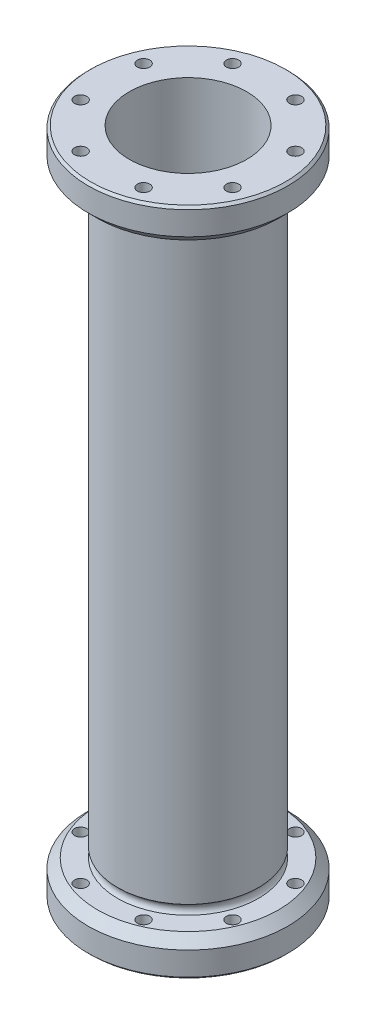
ISO-10303-21;
HEADER;
FILE_DESCRIPTION(('STEP AP214'),'2;1');
FILE_NAME('part.step','',(''),(''),'','','');
FILE_SCHEMA(('AUTOMOTIVE_DESIGN { 1 0 10303 214 1 1 1 1 }'));
ENDSEC;
DATA;
#1=APPLICATION_CONTEXT('core data for automotive mechanical design processes');
#2=APPLICATION_PROTOCOL_DEFINITION('international standard','automotive_design',2000,#1);
#3=PRODUCT_CONTEXT('',#1,'mechanical');
#4=PRODUCT('Part','Part','',(#3));
#5=PRODUCT_RELATED_PRODUCT_CATEGORY('part','',(#4));
#6=PRODUCT_DEFINITION_FORMATION('','',#4);
#7=PRODUCT_DEFINITION_CONTEXT('part definition',#1,'design');
#8=PRODUCT_DEFINITION('design','',#6,#7);
#9=PRODUCT_DEFINITION_SHAPE('','',#8);
#10=(LENGTH_UNIT() NAMED_UNIT(*) SI_UNIT(.MILLI.,.METRE.));
#11=(NAMED_UNIT(*) PLANE_ANGLE_UNIT() SI_UNIT($,.RADIAN.));
#12=(NAMED_UNIT(*) SI_UNIT($,.STERADIAN.) SOLID_ANGLE_UNIT());
#13=UNCERTAINTY_MEASURE_WITH_UNIT(LENGTH_MEASURE(1.E-05),#10,'distance_accuracy_value','');
#14=(GEOMETRIC_REPRESENTATION_CONTEXT(3) GLOBAL_UNCERTAINTY_ASSIGNED_CONTEXT((#13)) GLOBAL_UNIT_ASSIGNED_CONTEXT((#10,
#11,#12)) REPRESENTATION_CONTEXT('',''));
#15=CARTESIAN_POINT('',(0.,0.,0.));
#16=DIRECTION('',(0.,0.,1.));
#17=DIRECTION('',(1.,0.,0.));
#18=AXIS2_PLACEMENT_3D('',#15,#16,#17);
#19=CARTESIAN_POINT('',(85.,570.,0.));
#20=DIRECTION('',(0.,1.,0.));
#21=DIRECTION('',(0.,0.,1.));
#22=AXIS2_PLACEMENT_3D('',#19,#20,#21);
#23=PLANE('',#22);
#24=CARTESIAN_POINT('',(0.,570.,0.));
#25=DIRECTION('',(0.,1.,0.));
#26=DIRECTION('',(0.,0.,1.));
#27=AXIS2_PLACEMENT_3D('',#24,#25,#26);
#28=CIRCLE('',#27,82.9999999999999);
#29=CARTESIAN_POINT('',(0.,570.,82.9999999999999));
#30=VERTEX_POINT('',#29);
#31=EDGE_CURVE('E43',#30,#30,#28,.T.);
#32=ORIENTED_EDGE('',*,*,#31,.T.);
#33=EDGE_LOOP('',(#32));
#34=FACE_BOUND('',#33,.T.);
#35=CARTESIAN_POINT('',(-26.787840265557,570.,64.6715672757898));
#36=DIRECTION('',(0.,-1.,0.));
#37=DIRECTION('',(0.,0.,-1.));
#38=AXIS2_PLACEMENT_3D('',#35,#36,#37);
#39=CIRCLE('',#38,5.24999999999986);
#40=CARTESIAN_POINT('',(-26.787840265557,570.,59.4215672757899));
#41=VERTEX_POINT('',#40);
#42=EDGE_CURVE('E69',#41,#41,#39,.T.);
#43=ORIENTED_EDGE('',*,*,#42,.T.);
#44=EDGE_LOOP('',(#43));
#45=FACE_BOUND('',#44,.T.);
#46=CARTESIAN_POINT('',(26.7878402655566,570.,-64.67156727579));
#47=DIRECTION('',(0.,-1.,0.));
#48=DIRECTION('',(0.,0.,-1.));
#49=AXIS2_PLACEMENT_3D('',#46,#47,#48);
#50=CIRCLE('',#49,5.24999999999986);
#51=CARTESIAN_POINT('',(26.7878402655566,570.,-69.9215672757898));
#52=VERTEX_POINT('',#51);
#53=EDGE_CURVE('E144',#52,#52,#50,.T.);
#54=ORIENTED_EDGE('',*,*,#53,.T.);
#55=EDGE_LOOP('',(#54));
#56=FACE_BOUND('',#55,.T.);
#57=CARTESIAN_POINT('',(-26.7878402655561,570.,-64.6715672757902));
#58=DIRECTION('',(0.,-1.,0.));
#59=DIRECTION('',(0.,0.,-1.));
#60=AXIS2_PLACEMENT_3D('',#57,#58,#59);
#61=CIRCLE('',#60,5.24999999999986);
#62=CARTESIAN_POINT('',(-26.7878402655561,570.,-69.92156727579));
#63=VERTEX_POINT('',#62);
#64=EDGE_CURVE('E132',#63,#63,#61,.T.);
#65=ORIENTED_EDGE('',*,*,#64,.T.);
#66=EDGE_LOOP('',(#65));
#67=FACE_BOUND('',#66,.T.);
#68=CARTESIAN_POINT('',(-64.6715672757901,570.,-26.7878402655564));
#69=DIRECTION('',(0.,-1.,0.));
#70=DIRECTION('',(0.,0.,-1.));
#71=AXIS2_PLACEMENT_3D('',#68,#69,#70);
#72=CIRCLE('',#71,5.24999999999986);
#73=CARTESIAN_POINT('',(-64.6715672757901,570.,-32.0378402655562));
#74=VERTEX_POINT('',#73);
#75=EDGE_CURVE('E120',#74,#74,#72,.T.);
#76=ORIENTED_EDGE('',*,*,#75,.T.);
#77=EDGE_LOOP('',(#76));
#78=FACE_BOUND('',#77,.T.);
#79=CARTESIAN_POINT('',(-64.6715672757901,570.,26.7878402655563));
#80=DIRECTION('',(0.,-1.,0.));
#81=DIRECTION('',(0.,0.,-1.));
#82=AXIS2_PLACEMENT_3D('',#79,#80,#81);
#83=CIRCLE('',#82,5.24999999999986);
#84=CARTESIAN_POINT('',(-64.6715672757901,570.,21.5378402655565));
#85=VERTEX_POINT('',#84);
#86=EDGE_CURVE('E108',#85,#85,#83,.T.);
#87=ORIENTED_EDGE('',*,*,#86,.T.);
#88=EDGE_LOOP('',(#87));
#89=FACE_BOUND('',#88,.T.);
#90=CARTESIAN_POINT('',(0.,570.,0.));
#91=DIRECTION('',(0.,-1.,0.));
#92=DIRECTION('',(0.,0.,-1.));
#93=AXIS2_PLACEMENT_3D('',#90,#91,#92);
#94=CIRCLE('',#93,50.);
#95=CARTESIAN_POINT('',(0.,570.,-50.));
#96=VERTEX_POINT('',#95);
#97=EDGE_CURVE('E87',#96,#96,#94,.T.);
#98=ORIENTED_EDGE('',*,*,#97,.T.);
#99=EDGE_LOOP('',(#98));
#100=FACE_BOUND('',#99,.T.);
#101=CARTESIAN_POINT('',(64.6715672757901,570.,-26.7878402655563));
#102=DIRECTION('',(0.,-1.,0.));
#103=DIRECTION('',(0.,0.,-1.));
#104=AXIS2_PLACEMENT_3D('',#101,#102,#103);
#105=CIRCLE('',#104,5.24999999999987);
#106=CARTESIAN_POINT('',(64.6715672757901,570.,-32.0378402655562));
#107=VERTEX_POINT('',#106);
#108=EDGE_CURVE('E84',#107,#107,#105,.T.);
#109=ORIENTED_EDGE('',*,*,#108,.T.);
#110=EDGE_LOOP('',(#109));
#111=FACE_BOUND('',#110,.T.);
#112=CARTESIAN_POINT('',(64.6715672757899,570.,26.7878402655568));
#113=DIRECTION('',(0.,-1.,0.));
#114=DIRECTION('',(0.,0.,-1.));
#115=AXIS2_PLACEMENT_3D('',#112,#113,#114);
#116=CIRCLE('',#115,5.24999999999987);
#117=CARTESIAN_POINT('',(64.6715672757899,570.,21.5378402655569));
#118=VERTEX_POINT('',#117);
#119=EDGE_CURVE('E79',#118,#118,#116,.T.);
#120=ORIENTED_EDGE('',*,*,#119,.T.);
#121=EDGE_LOOP('',(#120));
#122=FACE_BOUND('',#121,.T.);
#123=CARTESIAN_POINT('',(26.7878402655557,570.,64.6715672757903));
#124=DIRECTION('',(0.,-1.,0.));
#125=DIRECTION('',(0.,0.,-1.));
#126=AXIS2_PLACEMENT_3D('',#123,#124,#125);
#127=CIRCLE('',#126,5.24999999999986);
#128=CARTESIAN_POINT('',(26.7878402655557,570.,59.4215672757905));
#129=VERTEX_POINT('',#128);
#130=EDGE_CURVE('E74',#129,#129,#127,.T.);
#131=ORIENTED_EDGE('',*,*,#130,.T.);
#132=EDGE_LOOP('',(#131));
#133=FACE_BOUND('',#132,.T.);
#134=ADVANCED_FACE('F32',(#34,#45,#56,#67,#78,#89,#100,#111,#122,#133),#23,.T.);
#135=CARTESIAN_POINT('',(0.,-1001.13524312968,0.));
#136=DIRECTION('',(0.,-1.,0.));
#137=DIRECTION('',(0.,0.,-1.));
#138=AXIS2_PLACEMENT_3D('',#135,#136,#137);
#139=CYLINDRICAL_SURFACE('',#138,60.);
#140=CARTESIAN_POINT('',(0.,532.,0.));
#141=DIRECTION('',(0.,1.,0.));
#142=DIRECTION('',(0.,0.,1.));
#143=AXIS2_PLACEMENT_3D('',#140,#141,#142);
#144=CIRCLE('',#143,60.);
#145=CARTESIAN_POINT('',(0.,532.,60.));
#146=VERTEX_POINT('',#145);
#147=EDGE_CURVE('E90',#146,#146,#144,.T.);
#148=ORIENTED_EDGE('',*,*,#147,.F.);
#149=EDGE_LOOP('',(#148));
#150=FACE_BOUND('',#149,.T.);
#151=CARTESIAN_POINT('',(0.,38.,0.));
#152=DIRECTION('',(0.,1.,0.));
#153=DIRECTION('',(0.,0.,1.));
#154=AXIS2_PLACEMENT_3D('',#151,#152,#153);
#155=CIRCLE('',#154,60.);
#156=CARTESIAN_POINT('',(0.,38.,60.));
#157=VERTEX_POINT('',#156);
#158=EDGE_CURVE('E99',#157,#157,#155,.T.);
#159=ORIENTED_EDGE('',*,*,#158,.T.);
#160=EDGE_LOOP('',(#159));
#161=FACE_BOUND('',#160,.T.);
#162=ADVANCED_FACE('F205',(#150,#161),#139,.T.);
#163=CARTESIAN_POINT('',(0.,-1001.13524312968,0.));
#164=DIRECTION('',(0.,-1.,0.));
#165=DIRECTION('',(0.,0.,-1.));
#166=AXIS2_PLACEMENT_3D('',#163,#164,#165);
#167=CYLINDRICAL_SURFACE('',#166,50.);
#168=CARTESIAN_POINT('',(0.,0.,0.));
#169=DIRECTION('',(0.,-1.,0.));
#170=DIRECTION('',(0.,0.,-1.));
#171=AXIS2_PLACEMENT_3D('',#168,#169,#170);
#172=CIRCLE('',#171,50.0000000000001);
#173=CARTESIAN_POINT('',(0.,0.,-50.0000000000001));
#174=VERTEX_POINT('',#173);
#175=EDGE_CURVE('E64',#174,#174,#172,.T.);
#176=ORIENTED_EDGE('',*,*,#175,.T.);
#177=EDGE_LOOP('',(#176));
#178=FACE_BOUND('',#177,.T.);
#179=ORIENTED_EDGE('',*,*,#97,.F.);
#180=EDGE_LOOP('',(#179));
#181=FACE_BOUND('',#180,.T.);
#182=ADVANCED_FACE('F185',(#178,#181),#167,.F.);
#183=CARTESIAN_POINT('',(50.0000000000001,0.,0.));
#184=DIRECTION('',(0.,-1.,0.));
#185=DIRECTION('',(0.,0.,-1.));
#186=AXIS2_PLACEMENT_3D('',#183,#184,#185);
#187=PLANE('',#186);
#188=CARTESIAN_POINT('',(0.,0.,0.));
#189=DIRECTION('',(0.,-1.,0.));
#190=DIRECTION('',(0.,0.,-1.));
#191=AXIS2_PLACEMENT_3D('',#188,#189,#190);
#192=CIRCLE('',#191,83.);
#193=CARTESIAN_POINT('',(0.,0.,-83.));
#194=VERTEX_POINT('',#193);
#195=EDGE_CURVE('E39',#194,#194,#192,.T.);
#196=ORIENTED_EDGE('',*,*,#195,.T.);
#197=EDGE_LOOP('',(#196));
#198=FACE_BOUND('',#197,.T.);
#199=CARTESIAN_POINT('',(-26.787840265557,0.,64.6715672757898));
#200=DIRECTION('',(0.,-1.,0.));
#201=DIRECTION('',(0.,0.,-1.));
#202=AXIS2_PLACEMENT_3D('',#199,#200,#201);
#203=CIRCLE('',#202,5.24999999999999);
#204=CARTESIAN_POINT('',(-26.787840265557,0.,59.4215672757898));
#205=VERTEX_POINT('',#204);
#206=EDGE_CURVE('E175',#205,#205,#203,.T.);
#207=ORIENTED_EDGE('',*,*,#206,.F.);
#208=EDGE_LOOP('',(#207));
#209=FACE_BOUND('',#208,.T.);
#210=CARTESIAN_POINT('',(26.7878402655557,0.,64.6715672757903));
#211=DIRECTION('',(0.,-1.,0.));
#212=DIRECTION('',(0.,0.,-1.));
#213=AXIS2_PLACEMENT_3D('',#210,#211,#212);
#214=CIRCLE('',#213,5.24999999999999);
#215=CARTESIAN_POINT('',(26.7878402655557,0.,59.4215672757903));
#216=VERTEX_POINT('',#215);
#217=EDGE_CURVE('E168',#216,#216,#214,.T.);
#218=ORIENTED_EDGE('',*,*,#217,.F.);
#219=EDGE_LOOP('',(#218));
#220=FACE_BOUND('',#219,.T.);
#221=CARTESIAN_POINT('',(64.6715672757899,0.,26.7878402655568));
#222=DIRECTION('',(0.,-1.,0.));
#223=DIRECTION('',(0.,0.,-1.));
#224=AXIS2_PLACEMENT_3D('',#221,#222,#223);
#225=CIRCLE('',#224,5.24999999999999);
#226=CARTESIAN_POINT('',(64.6715672757899,0.,21.5378402655568));
#227=VERTEX_POINT('',#226);
#228=EDGE_CURVE('E161',#227,#227,#225,.T.);
#229=ORIENTED_EDGE('',*,*,#228,.F.);
#230=EDGE_LOOP('',(#229));
#231=FACE_BOUND('',#230,.T.);
#232=CARTESIAN_POINT('',(64.6715672757901,0.,-26.7878402655563));
#233=DIRECTION('',(0.,-1.,0.));
#234=DIRECTION('',(0.,0.,-1.));
#235=AXIS2_PLACEMENT_3D('',#232,#233,#234);
#236=CIRCLE('',#235,5.24999999999999);
#237=CARTESIAN_POINT('',(64.6715672757901,0.,-32.0378402655563));
#238=VERTEX_POINT('',#237);
#239=EDGE_CURVE('E154',#238,#238,#236,.T.);
#240=ORIENTED_EDGE('',*,*,#239,.F.);
#241=EDGE_LOOP('',(#240));
#242=FACE_BOUND('',#241,.T.);
#243=CARTESIAN_POINT('',(26.7878402655566,0.,-64.67156727579));
#244=DIRECTION('',(0.,-1.,0.));
#245=DIRECTION('',(0.,0.,-1.));
#246=AXIS2_PLACEMENT_3D('',#243,#244,#245);
#247=CIRCLE('',#246,5.24999999999999);
#248=CARTESIAN_POINT('',(26.7878402655566,0.,-69.92156727579));
#249=VERTEX_POINT('',#248);
#250=EDGE_CURVE('E147',#249,#249,#247,.T.);
#251=ORIENTED_EDGE('',*,*,#250,.F.);
#252=EDGE_LOOP('',(#251));
#253=FACE_BOUND('',#252,.T.);
#254=CARTESIAN_POINT('',(-26.7878402655561,0.,-64.6715672757902));
#255=DIRECTION('',(0.,-1.,0.));
#256=DIRECTION('',(0.,0.,-1.));
#257=AXIS2_PLACEMENT_3D('',#254,#255,#256);
#258=CIRCLE('',#257,5.24999999999999);
#259=CARTESIAN_POINT('',(-26.7878402655561,0.,-69.9215672757901));
#260=VERTEX_POINT('',#259);
#261=EDGE_CURVE('E135',#260,#260,#258,.T.);
#262=ORIENTED_EDGE('',*,*,#261,.F.);
#263=EDGE_LOOP('',(#262));
#264=FACE_BOUND('',#263,.T.);
#265=CARTESIAN_POINT('',(-64.6715672757901,0.,-26.7878402655564));
#266=DIRECTION('',(0.,-1.,0.));
#267=DIRECTION('',(0.,0.,-1.));
#268=AXIS2_PLACEMENT_3D('',#265,#266,#267);
#269=CIRCLE('',#268,5.24999999999999);
#270=CARTESIAN_POINT('',(-64.6715672757901,0.,-32.0378402655563));
#271=VERTEX_POINT('',#270);
#272=EDGE_CURVE('E123',#271,#271,#269,.T.);
#273=ORIENTED_EDGE('',*,*,#272,.F.);
#274=EDGE_LOOP('',(#273));
#275=FACE_BOUND('',#274,.T.);
#276=CARTESIAN_POINT('',(-64.6715672757901,0.,26.7878402655563));
#277=DIRECTION('',(0.,-1.,0.));
#278=DIRECTION('',(0.,0.,-1.));
#279=AXIS2_PLACEMENT_3D('',#276,#277,#278);
#280=CIRCLE('',#279,5.24999999999999);
#281=CARTESIAN_POINT('',(-64.6715672757901,0.,21.5378402655563));
#282=VERTEX_POINT('',#281);
#283=EDGE_CURVE('E111',#282,#282,#280,.T.);
#284=ORIENTED_EDGE('',*,*,#283,.F.);
#285=EDGE_LOOP('',(#284));
#286=FACE_BOUND('',#285,.T.);
#287=ORIENTED_EDGE('',*,*,#175,.F.);
#288=EDGE_LOOP('',(#287));
#289=FACE_BOUND('',#288,.T.);
#290=ADVANCED_FACE('F181',(#198,#209,#220,#231,#242,#253,#264,#275,#286,#289),#187,.T.);
#291=CARTESIAN_POINT('',(0.,-1001.13524312968,0.));
#292=DIRECTION('',(0.,-1.,0.));
#293=DIRECTION('',(0.,0.,-1.));
#294=AXIS2_PLACEMENT_3D('',#291,#292,#293);
#295=CYLINDRICAL_SURFACE('',#294,85.);
#296=CARTESIAN_POINT('',(0.,2.00000000000022,0.));
#297=DIRECTION('',(0.,-1.,0.));
#298=DIRECTION('',(0.,0.,-1.));
#299=AXIS2_PLACEMENT_3D('',#296,#297,#298);
#300=CIRCLE('',#299,85.);
#301=CARTESIAN_POINT('',(0.,2.00000000000022,-85.));
#302=VERTEX_POINT('',#301);
#303=EDGE_CURVE('E10',#302,#302,#300,.F.);
#304=ORIENTED_EDGE('',*,*,#303,.T.);
#305=EDGE_LOOP('',(#304));
#306=FACE_BOUND('',#305,.T.);
#307=CARTESIAN_POINT('',(0.,21.9999999999998,0.));
#308=DIRECTION('',(0.,1.,0.));
#309=DIRECTION('',(0.,0.,1.));
#310=AXIS2_PLACEMENT_3D('',#307,#308,#309);
#311=CIRCLE('',#310,85.);
#312=CARTESIAN_POINT('',(0.,21.9999999999998,85.));
#313=VERTEX_POINT('',#312);
#314=EDGE_CURVE('E55',#313,#313,#311,.F.);
#315=ORIENTED_EDGE('',*,*,#314,.T.);
#316=EDGE_LOOP('',(#315));
#317=FACE_BOUND('',#316,.T.);
#318=ADVANCED_FACE('F184',(#306,#317),#295,.T.);
#319=CARTESIAN_POINT('',(85.,30.,0.));
#320=DIRECTION('',(0.,1.,0.));
#321=DIRECTION('',(0.,0.,1.));
#322=AXIS2_PLACEMENT_3D('',#319,#320,#321);
#323=PLANE('',#322);
#324=CARTESIAN_POINT('',(0.,30.,0.));
#325=DIRECTION('',(0.,1.,0.));
#326=DIRECTION('',(0.,0.,1.));
#327=AXIS2_PLACEMENT_3D('',#324,#325,#326);
#328=CIRCLE('',#327,76.9999999999999);
#329=CARTESIAN_POINT('',(0.,30.,76.9999999999999));
#330=VERTEX_POINT('',#329);
#331=EDGE_CURVE('E52',#330,#330,#328,.T.);
#332=ORIENTED_EDGE('',*,*,#331,.T.);
#333=EDGE_LOOP('',(#332));
#334=FACE_BOUND('',#333,.T.);
#335=CARTESIAN_POINT('',(-26.787840265557,30.,64.6715672757898));
#336=DIRECTION('',(0.,1.,0.));
#337=DIRECTION('',(0.,0.,1.));
#338=AXIS2_PLACEMENT_3D('',#335,#336,#337);
#339=CIRCLE('',#338,5.24999999999992);
#340=CARTESIAN_POINT('',(-26.787840265557,30.,69.9215672757897));
#341=VERTEX_POINT('',#340);
#342=EDGE_CURVE('E68',#341,#341,#339,.T.);
#343=ORIENTED_EDGE('',*,*,#342,.F.);
#344=EDGE_LOOP('',(#343));
#345=FACE_BOUND('',#344,.T.);
#346=CARTESIAN_POINT('',(26.7878402655557,30.,64.6715672757903));
#347=DIRECTION('',(0.,1.,0.));
#348=DIRECTION('',(0.,0.,1.));
#349=AXIS2_PLACEMENT_3D('',#346,#347,#348);
#350=CIRCLE('',#349,5.24999999999992);
#351=CARTESIAN_POINT('',(26.7878402655557,30.,69.9215672757903));
#352=VERTEX_POINT('',#351);
#353=EDGE_CURVE('E70',#352,#352,#350,.T.);
#354=ORIENTED_EDGE('',*,*,#353,.F.);
#355=EDGE_LOOP('',(#354));
#356=FACE_BOUND('',#355,.T.);
#357=CARTESIAN_POINT('',(64.6715672757899,30.,26.7878402655568));
#358=DIRECTION('',(0.,1.,0.));
#359=DIRECTION('',(0.,0.,1.));
#360=AXIS2_PLACEMENT_3D('',#357,#358,#359);
#361=CIRCLE('',#360,5.24999999999993);
#362=CARTESIAN_POINT('',(64.6715672757899,30.,32.0378402655567));
#363=VERTEX_POINT('',#362);
#364=EDGE_CURVE('E75',#363,#363,#361,.T.);
#365=ORIENTED_EDGE('',*,*,#364,.F.);
#366=EDGE_LOOP('',(#365));
#367=FACE_BOUND('',#366,.T.);
#368=CARTESIAN_POINT('',(64.6715672757901,30.,-26.7878402655563));
#369=DIRECTION('',(0.,1.,0.));
#370=DIRECTION('',(0.,0.,1.));
#371=AXIS2_PLACEMENT_3D('',#368,#369,#370);
#372=CIRCLE('',#371,5.24999999999993);
#373=CARTESIAN_POINT('',(64.6715672757901,30.,-21.5378402655564));
#374=VERTEX_POINT('',#373);
#375=EDGE_CURVE('E83',#374,#374,#372,.T.);
#376=ORIENTED_EDGE('',*,*,#375,.F.);
#377=EDGE_LOOP('',(#376));
#378=FACE_BOUND('',#377,.T.);
#379=CARTESIAN_POINT('',(26.7878402655566,30.,-64.67156727579));
#380=DIRECTION('',(0.,1.,0.));
#381=DIRECTION('',(0.,0.,1.));
#382=AXIS2_PLACEMENT_3D('',#379,#380,#381);
#383=CIRCLE('',#382,5.24999999999992);
#384=CARTESIAN_POINT('',(26.7878402655566,30.,-59.42156727579));
#385=VERTEX_POINT('',#384);
#386=EDGE_CURVE('E141',#385,#385,#383,.T.);
#387=ORIENTED_EDGE('',*,*,#386,.F.);
#388=EDGE_LOOP('',(#387));
#389=FACE_BOUND('',#388,.T.);
#390=CARTESIAN_POINT('',(-26.7878402655561,30.,-64.6715672757902));
#391=DIRECTION('',(0.,1.,0.));
#392=DIRECTION('',(0.,0.,1.));
#393=AXIS2_PLACEMENT_3D('',#390,#391,#392);
#394=CIRCLE('',#393,5.24999999999992);
#395=CARTESIAN_POINT('',(-26.7878402655561,30.,-59.4215672757902));
#396=VERTEX_POINT('',#395);
#397=EDGE_CURVE('E126',#396,#396,#394,.T.);
#398=ORIENTED_EDGE('',*,*,#397,.F.);
#399=EDGE_LOOP('',(#398));
#400=FACE_BOUND('',#399,.T.);
#401=CARTESIAN_POINT('',(-64.6715672757901,30.,-26.7878402655564));
#402=DIRECTION('',(0.,1.,0.));
#403=DIRECTION('',(0.,0.,1.));
#404=AXIS2_PLACEMENT_3D('',#401,#402,#403);
#405=CIRCLE('',#404,5.24999999999992);
#406=CARTESIAN_POINT('',(-64.6715672757901,30.,-21.5378402655564));
#407=VERTEX_POINT('',#406);
#408=EDGE_CURVE('E117',#407,#407,#405,.T.);
#409=ORIENTED_EDGE('',*,*,#408,.F.);
#410=EDGE_LOOP('',(#409));
#411=FACE_BOUND('',#410,.T.);
#412=CARTESIAN_POINT('',(-64.6715672757901,30.,26.7878402655563));
#413=DIRECTION('',(0.,1.,0.));
#414=DIRECTION('',(0.,0.,1.));
#415=AXIS2_PLACEMENT_3D('',#412,#413,#414);
#416=CIRCLE('',#415,5.24999999999992);
#417=CARTESIAN_POINT('',(-64.6715672757901,30.,32.0378402655563));
#418=VERTEX_POINT('',#417);
#419=EDGE_CURVE('E105',#418,#418,#416,.T.);
#420=ORIENTED_EDGE('',*,*,#419,.F.);
#421=EDGE_LOOP('',(#420));
#422=FACE_BOUND('',#421,.T.);
#423=CARTESIAN_POINT('',(0.,30.,0.));
#424=DIRECTION('',(0.,1.,0.));
#425=DIRECTION('',(0.,0.,1.));
#426=AXIS2_PLACEMENT_3D('',#423,#424,#425);
#427=CIRCLE('',#426,60.);
#428=CARTESIAN_POINT('',(0.,30.,60.));
#429=VERTEX_POINT('',#428);
#430=EDGE_CURVE('E96',#429,#429,#427,.T.);
#431=ORIENTED_EDGE('',*,*,#430,.F.);
#432=EDGE_LOOP('',(#431));
#433=FACE_BOUND('',#432,.T.);
#434=ADVANCED_FACE('F278',(#334,#345,#356,#367,#378,#389,#400,#411,#422,#433),#323,.T.);
#435=CARTESIAN_POINT('',(60.,540.,0.));
#436=DIRECTION('',(0.,-1.,0.));
#437=DIRECTION('',(0.,0.,-1.));
#438=AXIS2_PLACEMENT_3D('',#435,#436,#437);
#439=PLANE('',#438);
#440=CARTESIAN_POINT('',(0.,540.,0.));
#441=DIRECTION('',(0.,-1.,0.));
#442=DIRECTION('',(0.,0.,-1.));
#443=AXIS2_PLACEMENT_3D('',#440,#441,#442);
#444=CIRCLE('',#443,77.0000000000002);
#445=CARTESIAN_POINT('',(0.,540.,-77.0000000000002));
#446=VERTEX_POINT('',#445);
#447=EDGE_CURVE('E61',#446,#446,#444,.T.);
#448=ORIENTED_EDGE('',*,*,#447,.T.);
#449=EDGE_LOOP('',(#448));
#450=FACE_BOUND('',#449,.T.);
#451=CARTESIAN_POINT('',(-26.787840265557,540.,64.6715672757898));
#452=DIRECTION('',(0.,-1.,0.));
#453=DIRECTION('',(0.,0.,-1.));
#454=AXIS2_PLACEMENT_3D('',#451,#452,#453);
#455=CIRCLE('',#454,5.24999999999992);
#456=CARTESIAN_POINT('',(-26.787840265557,540.,59.4215672757898));
#457=VERTEX_POINT('',#456);
#458=EDGE_CURVE('E65',#457,#457,#455,.T.);
#459=ORIENTED_EDGE('',*,*,#458,.F.);
#460=EDGE_LOOP('',(#459));
#461=FACE_BOUND('',#460,.T.);
#462=CARTESIAN_POINT('',(26.7878402655557,540.,64.6715672757903));
#463=DIRECTION('',(0.,-1.,0.));
#464=DIRECTION('',(0.,0.,-1.));
#465=AXIS2_PLACEMENT_3D('',#462,#463,#464);
#466=CIRCLE('',#465,5.24999999999992);
#467=CARTESIAN_POINT('',(26.7878402655557,540.,59.4215672757904));
#468=VERTEX_POINT('',#467);
#469=EDGE_CURVE('E73',#468,#468,#466,.T.);
#470=ORIENTED_EDGE('',*,*,#469,.F.);
#471=EDGE_LOOP('',(#470));
#472=FACE_BOUND('',#471,.T.);
#473=CARTESIAN_POINT('',(64.6715672757899,540.,26.7878402655568));
#474=DIRECTION('',(0.,-1.,0.));
#475=DIRECTION('',(0.,0.,-1.));
#476=AXIS2_PLACEMENT_3D('',#473,#474,#475);
#477=CIRCLE('',#476,5.24999999999993);
#478=CARTESIAN_POINT('',(64.6715672757899,540.,21.5378402655569));
#479=VERTEX_POINT('',#478);
#480=EDGE_CURVE('E78',#479,#479,#477,.T.);
#481=ORIENTED_EDGE('',*,*,#480,.F.);
#482=EDGE_LOOP('',(#481));
#483=FACE_BOUND('',#482,.T.);
#484=CARTESIAN_POINT('',(64.6715672757901,540.,-26.7878402655563));
#485=DIRECTION('',(0.,-1.,0.));
#486=DIRECTION('',(0.,0.,-1.));
#487=AXIS2_PLACEMENT_3D('',#484,#485,#486);
#488=CIRCLE('',#487,5.24999999999993);
#489=CARTESIAN_POINT('',(64.6715672757901,540.,-32.0378402655563));
#490=VERTEX_POINT('',#489);
#491=EDGE_CURVE('E80',#490,#490,#488,.T.);
#492=ORIENTED_EDGE('',*,*,#491,.F.);
#493=EDGE_LOOP('',(#492));
#494=FACE_BOUND('',#493,.T.);
#495=CARTESIAN_POINT('',(26.7878402655566,540.,-64.67156727579));
#496=DIRECTION('',(0.,-1.,0.));
#497=DIRECTION('',(0.,0.,-1.));
#498=AXIS2_PLACEMENT_3D('',#495,#496,#497);
#499=CIRCLE('',#498,5.24999999999992);
#500=CARTESIAN_POINT('',(26.7878402655566,540.,-69.9215672757899));
#501=VERTEX_POINT('',#500);
#502=EDGE_CURVE('E138',#501,#501,#499,.T.);
#503=ORIENTED_EDGE('',*,*,#502,.F.);
#504=EDGE_LOOP('',(#503));
#505=FACE_BOUND('',#504,.T.);
#506=CARTESIAN_POINT('',(-26.7878402655561,540.,-64.6715672757902));
#507=DIRECTION('',(0.,-1.,0.));
#508=DIRECTION('',(0.,0.,-1.));
#509=AXIS2_PLACEMENT_3D('',#506,#507,#508);
#510=CIRCLE('',#509,5.24999999999992);
#511=CARTESIAN_POINT('',(-26.7878402655561,540.,-69.9215672757901));
#512=VERTEX_POINT('',#511);
#513=EDGE_CURVE('E129',#512,#512,#510,.T.);
#514=ORIENTED_EDGE('',*,*,#513,.F.);
#515=EDGE_LOOP('',(#514));
#516=FACE_BOUND('',#515,.T.);
#517=CARTESIAN_POINT('',(-64.6715672757901,540.,-26.7878402655564));
#518=DIRECTION('',(0.,-1.,0.));
#519=DIRECTION('',(0.,0.,-1.));
#520=AXIS2_PLACEMENT_3D('',#517,#518,#519);
#521=CIRCLE('',#520,5.24999999999992);
#522=CARTESIAN_POINT('',(-64.6715672757901,540.,-32.0378402655563));
#523=VERTEX_POINT('',#522);
#524=EDGE_CURVE('E114',#523,#523,#521,.T.);
#525=ORIENTED_EDGE('',*,*,#524,.F.);
#526=EDGE_LOOP('',(#525));
#527=FACE_BOUND('',#526,.T.);
#528=CARTESIAN_POINT('',(-64.6715672757901,540.,26.7878402655563));
#529=DIRECTION('',(0.,-1.,0.));
#530=DIRECTION('',(0.,0.,-1.));
#531=AXIS2_PLACEMENT_3D('',#528,#529,#530);
#532=CIRCLE('',#531,5.24999999999992);
#533=CARTESIAN_POINT('',(-64.6715672757901,540.,21.5378402655564));
#534=VERTEX_POINT('',#533);
#535=EDGE_CURVE('E102',#534,#534,#532,.T.);
#536=ORIENTED_EDGE('',*,*,#535,.F.);
#537=EDGE_LOOP('',(#536));
#538=FACE_BOUND('',#537,.T.);
#539=CARTESIAN_POINT('',(0.,540.,0.));
#540=DIRECTION('',(0.,1.,0.));
#541=DIRECTION('',(0.,0.,1.));
#542=AXIS2_PLACEMENT_3D('',#539,#540,#541);
#543=CIRCLE('',#542,60.);
#544=CARTESIAN_POINT('',(0.,540.,60.));
#545=VERTEX_POINT('',#544);
#546=EDGE_CURVE('E93',#545,#545,#543,.T.);
#547=ORIENTED_EDGE('',*,*,#546,.T.);
#548=EDGE_LOOP('',(#547));
#549=FACE_BOUND('',#548,.T.);
#550=ADVANCED_FACE('F274',(#450,#461,#472,#483,#494,#505,#516,#527,#538,#549),#439,.T.);
#551=CARTESIAN_POINT('',(0.,-1001.13524312968,0.));
#552=DIRECTION('',(0.,-1.,0.));
#553=DIRECTION('',(0.,0.,-1.));
#554=AXIS2_PLACEMENT_3D('',#551,#552,#553);
#555=CYLINDRICAL_SURFACE('',#554,85.);
#556=CARTESIAN_POINT('',(0.,568.,0.));
#557=DIRECTION('',(0.,1.,0.));
#558=DIRECTION('',(0.,0.,1.));
#559=AXIS2_PLACEMENT_3D('',#556,#557,#558);
#560=CIRCLE('',#559,85.);
#561=CARTESIAN_POINT('',(0.,568.,85.));
#562=VERTEX_POINT('',#561);
#563=EDGE_CURVE('E47',#562,#562,#560,.F.);
#564=ORIENTED_EDGE('',*,*,#563,.T.);
#565=EDGE_LOOP('',(#564));
#566=FACE_BOUND('',#565,.T.);
#567=CARTESIAN_POINT('',(0.,548.,0.));
#568=DIRECTION('',(0.,-1.,0.));
#569=DIRECTION('',(0.,0.,-1.));
#570=AXIS2_PLACEMENT_3D('',#567,#568,#569);
#571=CIRCLE('',#570,85.);
#572=CARTESIAN_POINT('',(0.,548.,-85.));
#573=VERTEX_POINT('',#572);
#574=EDGE_CURVE('E58',#573,#573,#571,.F.);
#575=ORIENTED_EDGE('',*,*,#574,.T.);
#576=EDGE_LOOP('',(#575));
#577=FACE_BOUND('',#576,.T.);
#578=ADVANCED_FACE('F269',(#566,#577),#555,.T.);
#579=CARTESIAN_POINT('',(0.,536.,0.));
#580=DIRECTION('',(0.,1.,0.));
#581=DIRECTION('',(0.,0.,1.));
#582=AXIS2_PLACEMENT_3D('',#579,#580,#581);
#583=TOROIDAL_SURFACE('',#582,63.,5.);
#584=ORIENTED_EDGE('',*,*,#147,.T.);
#585=EDGE_LOOP('',(#584));
#586=FACE_BOUND('',#585,.T.);
#587=ORIENTED_EDGE('',*,*,#546,.F.);
#588=EDGE_LOOP('',(#587));
#589=FACE_BOUND('',#588,.T.);
#590=ADVANCED_FACE('F266',(#586,#589),#583,.F.);
#591=CARTESIAN_POINT('',(0.,34.,0.));
#592=DIRECTION('',(0.,1.,0.));
#593=DIRECTION('',(0.,0.,1.));
#594=AXIS2_PLACEMENT_3D('',#591,#592,#593);
#595=TOROIDAL_SURFACE('',#594,63.,5.);
#596=ORIENTED_EDGE('',*,*,#430,.T.);
#597=EDGE_LOOP('',(#596));
#598=FACE_BOUND('',#597,.T.);
#599=ORIENTED_EDGE('',*,*,#158,.F.);
#600=EDGE_LOOP('',(#599));
#601=FACE_BOUND('',#600,.T.);
#602=ADVANCED_FACE('F263',(#598,#601),#595,.F.);
#603=CARTESIAN_POINT('',(-64.6715672757901,0.,26.7878402655563));
#604=DIRECTION('',(0.,-1.,0.));
#605=DIRECTION('',(0.,0.,-1.));
#606=AXIS2_PLACEMENT_3D('',#603,#604,#605);
#607=CYLINDRICAL_SURFACE('',#606,5.24999999999992);
#608=ORIENTED_EDGE('',*,*,#535,.T.);
#609=EDGE_LOOP('',(#608));
#610=FACE_BOUND('',#609,.T.);
#611=ORIENTED_EDGE('',*,*,#86,.F.);
#612=EDGE_LOOP('',(#611));
#613=FACE_BOUND('',#612,.T.);
#614=ADVANCED_FACE('F261',(#610,#613),#607,.F.);
#615=ORIENTED_EDGE('',*,*,#419,.T.);
#616=EDGE_LOOP('',(#615));
#617=FACE_BOUND('',#616,.T.);
#618=ORIENTED_EDGE('',*,*,#283,.T.);
#619=EDGE_LOOP('',(#618));
#620=FACE_BOUND('',#619,.T.);
#621=ADVANCED_FACE('F258',(#617,#620),#607,.F.);
#622=CARTESIAN_POINT('',(-64.6715672757901,0.,-26.7878402655564));
#623=DIRECTION('',(0.,-1.,0.));
#624=DIRECTION('',(0.,0.,-1.));
#625=AXIS2_PLACEMENT_3D('',#622,#623,#624);
#626=CYLINDRICAL_SURFACE('',#625,5.24999999999992);
#627=ORIENTED_EDGE('',*,*,#524,.T.);
#628=EDGE_LOOP('',(#627));
#629=FACE_BOUND('',#628,.T.);
#630=ORIENTED_EDGE('',*,*,#75,.F.);
#631=EDGE_LOOP('',(#630));
#632=FACE_BOUND('',#631,.T.);
#633=ADVANCED_FACE('F256',(#629,#632),#626,.F.);
#634=ORIENTED_EDGE('',*,*,#408,.T.);
#635=EDGE_LOOP('',(#634));
#636=FACE_BOUND('',#635,.T.);
#637=ORIENTED_EDGE('',*,*,#272,.T.);
#638=EDGE_LOOP('',(#637));
#639=FACE_BOUND('',#638,.T.);
#640=ADVANCED_FACE('F252',(#636,#639),#626,.F.);
#641=CARTESIAN_POINT('',(-26.7878402655561,0.,-64.6715672757902));
#642=DIRECTION('',(0.,-1.,0.));
#643=DIRECTION('',(0.,0.,-1.));
#644=AXIS2_PLACEMENT_3D('',#641,#642,#643);
#645=CYLINDRICAL_SURFACE('',#644,5.24999999999992);
#646=ORIENTED_EDGE('',*,*,#513,.T.);
#647=EDGE_LOOP('',(#646));
#648=FACE_BOUND('',#647,.T.);
#649=ORIENTED_EDGE('',*,*,#64,.F.);
#650=EDGE_LOOP('',(#649));
#651=FACE_BOUND('',#650,.T.);
#652=ADVANCED_FACE('F248',(#648,#651),#645,.F.);
#653=ORIENTED_EDGE('',*,*,#397,.T.);
#654=EDGE_LOOP('',(#653));
#655=FACE_BOUND('',#654,.T.);
#656=ORIENTED_EDGE('',*,*,#261,.T.);
#657=EDGE_LOOP('',(#656));
#658=FACE_BOUND('',#657,.T.);
#659=ADVANCED_FACE('F251',(#655,#658),#645,.F.);
#660=CARTESIAN_POINT('',(26.7878402655566,0.,-64.67156727579));
#661=DIRECTION('',(0.,-1.,0.));
#662=DIRECTION('',(0.,0.,-1.));
#663=AXIS2_PLACEMENT_3D('',#660,#661,#662);
#664=CYLINDRICAL_SURFACE('',#663,5.24999999999992);
#665=ORIENTED_EDGE('',*,*,#502,.T.);
#666=EDGE_LOOP('',(#665));
#667=FACE_BOUND('',#666,.T.);
#668=ORIENTED_EDGE('',*,*,#53,.F.);
#669=EDGE_LOOP('',(#668));
#670=FACE_BOUND('',#669,.T.);
#671=ADVANCED_FACE('F246',(#667,#670),#664,.F.);
#672=ORIENTED_EDGE('',*,*,#386,.T.);
#673=EDGE_LOOP('',(#672));
#674=FACE_BOUND('',#673,.T.);
#675=ORIENTED_EDGE('',*,*,#250,.T.);
#676=EDGE_LOOP('',(#675));
#677=FACE_BOUND('',#676,.T.);
#678=ADVANCED_FACE('F242',(#674,#677),#664,.F.);
#679=CARTESIAN_POINT('',(64.6715672757901,0.,-26.7878402655563));
#680=DIRECTION('',(0.,-1.,0.));
#681=DIRECTION('',(0.,0.,-1.));
#682=AXIS2_PLACEMENT_3D('',#679,#680,#681);
#683=CYLINDRICAL_SURFACE('',#682,5.24999999999993);
#684=ORIENTED_EDGE('',*,*,#491,.T.);
#685=EDGE_LOOP('',(#684));
#686=FACE_BOUND('',#685,.T.);
#687=ORIENTED_EDGE('',*,*,#108,.F.);
#688=EDGE_LOOP('',(#687));
#689=FACE_BOUND('',#688,.T.);
#690=ADVANCED_FACE('F239',(#686,#689),#683,.F.);
#691=ORIENTED_EDGE('',*,*,#375,.T.);
#692=EDGE_LOOP('',(#691));
#693=FACE_BOUND('',#692,.T.);
#694=ORIENTED_EDGE('',*,*,#239,.T.);
#695=EDGE_LOOP('',(#694));
#696=FACE_BOUND('',#695,.T.);
#697=ADVANCED_FACE('F237',(#693,#696),#683,.F.);
#698=CARTESIAN_POINT('',(64.6715672757899,0.,26.7878402655568));
#699=DIRECTION('',(0.,-1.,0.));
#700=DIRECTION('',(0.,0.,-1.));
#701=AXIS2_PLACEMENT_3D('',#698,#699,#700);
#702=CYLINDRICAL_SURFACE('',#701,5.24999999999993);
#703=ORIENTED_EDGE('',*,*,#364,.T.);
#704=EDGE_LOOP('',(#703));
#705=FACE_BOUND('',#704,.T.);
#706=ORIENTED_EDGE('',*,*,#228,.T.);
#707=EDGE_LOOP('',(#706));
#708=FACE_BOUND('',#707,.T.);
#709=ADVANCED_FACE('F234',(#705,#708),#702,.F.);
#710=ORIENTED_EDGE('',*,*,#480,.T.);
#711=EDGE_LOOP('',(#710));
#712=FACE_BOUND('',#711,.T.);
#713=ORIENTED_EDGE('',*,*,#119,.F.);
#714=EDGE_LOOP('',(#713));
#715=FACE_BOUND('',#714,.T.);
#716=ADVANCED_FACE('F231',(#712,#715),#702,.F.);
#717=CARTESIAN_POINT('',(26.7878402655557,0.,64.6715672757903));
#718=DIRECTION('',(0.,-1.,0.));
#719=DIRECTION('',(0.,0.,-1.));
#720=AXIS2_PLACEMENT_3D('',#717,#718,#719);
#721=CYLINDRICAL_SURFACE('',#720,5.24999999999992);
#722=ORIENTED_EDGE('',*,*,#353,.T.);
#723=EDGE_LOOP('',(#722));
#724=FACE_BOUND('',#723,.T.);
#725=ORIENTED_EDGE('',*,*,#217,.T.);
#726=EDGE_LOOP('',(#725));
#727=FACE_BOUND('',#726,.T.);
#728=ADVANCED_FACE('F221',(#724,#727),#721,.F.);
#729=ORIENTED_EDGE('',*,*,#469,.T.);
#730=EDGE_LOOP('',(#729));
#731=FACE_BOUND('',#730,.T.);
#732=ORIENTED_EDGE('',*,*,#130,.F.);
#733=EDGE_LOOP('',(#732));
#734=FACE_BOUND('',#733,.T.);
#735=ADVANCED_FACE('F219',(#731,#734),#721,.F.);
#736=CARTESIAN_POINT('',(-26.787840265557,0.,64.6715672757898));
#737=DIRECTION('',(0.,-1.,0.));
#738=DIRECTION('',(0.,0.,-1.));
#739=AXIS2_PLACEMENT_3D('',#736,#737,#738);
#740=CYLINDRICAL_SURFACE('',#739,5.24999999999992);
#741=ORIENTED_EDGE('',*,*,#342,.T.);
#742=EDGE_LOOP('',(#741));
#743=FACE_BOUND('',#742,.T.);
#744=ORIENTED_EDGE('',*,*,#206,.T.);
#745=EDGE_LOOP('',(#744));
#746=FACE_BOUND('',#745,.T.);
#747=ADVANCED_FACE('F179',(#743,#746),#740,.F.);
#748=ORIENTED_EDGE('',*,*,#458,.T.);
#749=EDGE_LOOP('',(#748));
#750=FACE_BOUND('',#749,.T.);
#751=ORIENTED_EDGE('',*,*,#42,.F.);
#752=EDGE_LOOP('',(#751));
#753=FACE_BOUND('',#752,.T.);
#754=ADVANCED_FACE('F228',(#750,#753),#740,.F.);
#755=CARTESIAN_POINT('',(0.,540.,0.));
#756=DIRECTION('',(0.,1.,0.));
#757=DIRECTION('',(0.,0.,1.));
#758=AXIS2_PLACEMENT_3D('',#755,#756,#757);
#759=CONICAL_SURFACE('',#758,77.0000000000002,0.78539816339745);
#760=ORIENTED_EDGE('',*,*,#574,.F.);
#761=EDGE_LOOP('',(#760));
#762=FACE_BOUND('',#761,.T.);
#763=ORIENTED_EDGE('',*,*,#447,.F.);
#764=EDGE_LOOP('',(#763));
#765=FACE_BOUND('',#764,.T.);
#766=ADVANCED_FACE('F288',(#762,#765),#759,.T.);
#767=CARTESIAN_POINT('',(0.,21.9999999999998,0.));
#768=DIRECTION('',(0.,-1.,0.));
#769=DIRECTION('',(0.,0.,-1.));
#770=AXIS2_PLACEMENT_3D('',#767,#768,#769);
#771=CONICAL_SURFACE('',#770,85.,0.785398163397445);
#772=ORIENTED_EDGE('',*,*,#331,.F.);
#773=EDGE_LOOP('',(#772));
#774=FACE_BOUND('',#773,.T.);
#775=ORIENTED_EDGE('',*,*,#314,.F.);
#776=EDGE_LOOP('',(#775));
#777=FACE_BOUND('',#776,.T.);
#778=ADVANCED_FACE('F291',(#774,#777),#771,.T.);
#779=CARTESIAN_POINT('',(0.,568.,0.));
#780=DIRECTION('',(0.,-1.,0.));
#781=DIRECTION('',(0.,0.,-1.));
#782=AXIS2_PLACEMENT_3D('',#779,#780,#781);
#783=CONICAL_SURFACE('',#782,85.,0.785398163397414);
#784=ORIENTED_EDGE('',*,*,#31,.F.);
#785=EDGE_LOOP('',(#784));
#786=FACE_BOUND('',#785,.T.);
#787=ORIENTED_EDGE('',*,*,#563,.F.);
#788=EDGE_LOOP('',(#787));
#789=FACE_BOUND('',#788,.T.);
#790=ADVANCED_FACE('F294',(#786,#789),#783,.T.);
#791=CARTESIAN_POINT('',(0.,0.,0.));
#792=DIRECTION('',(0.,1.,0.));
#793=DIRECTION('',(0.,0.,1.));
#794=AXIS2_PLACEMENT_3D('',#791,#792,#793);
#795=CONICAL_SURFACE('',#794,83.,0.785398163397407);
#796=ORIENTED_EDGE('',*,*,#303,.F.);
#797=EDGE_LOOP('',(#796));
#798=FACE_BOUND('',#797,.T.);
#799=ORIENTED_EDGE('',*,*,#195,.F.);
#800=EDGE_LOOP('',(#799));
#801=FACE_BOUND('',#800,.T.);
#802=ADVANCED_FACE('F34',(#798,#801),#795,.T.);
#803=CLOSED_SHELL('',(#134,#162,#182,#290,#318,#434,#550,#578,#590,#602,#614,#621,#633,#640,
#652,#659,#671,#678,#690,#697,#709,#716,#728,#735,#747,#754,#766,#778,#790,#802));
#804=MANIFOLD_SOLID_BREP('B2',#803);
#805=ADVANCED_BREP_SHAPE_REPRESENTATION('',(#18,#804),#14);
#806=SHAPE_DEFINITION_REPRESENTATION(#9,#805);
ENDSEC;
END-ISO-10303-21;
